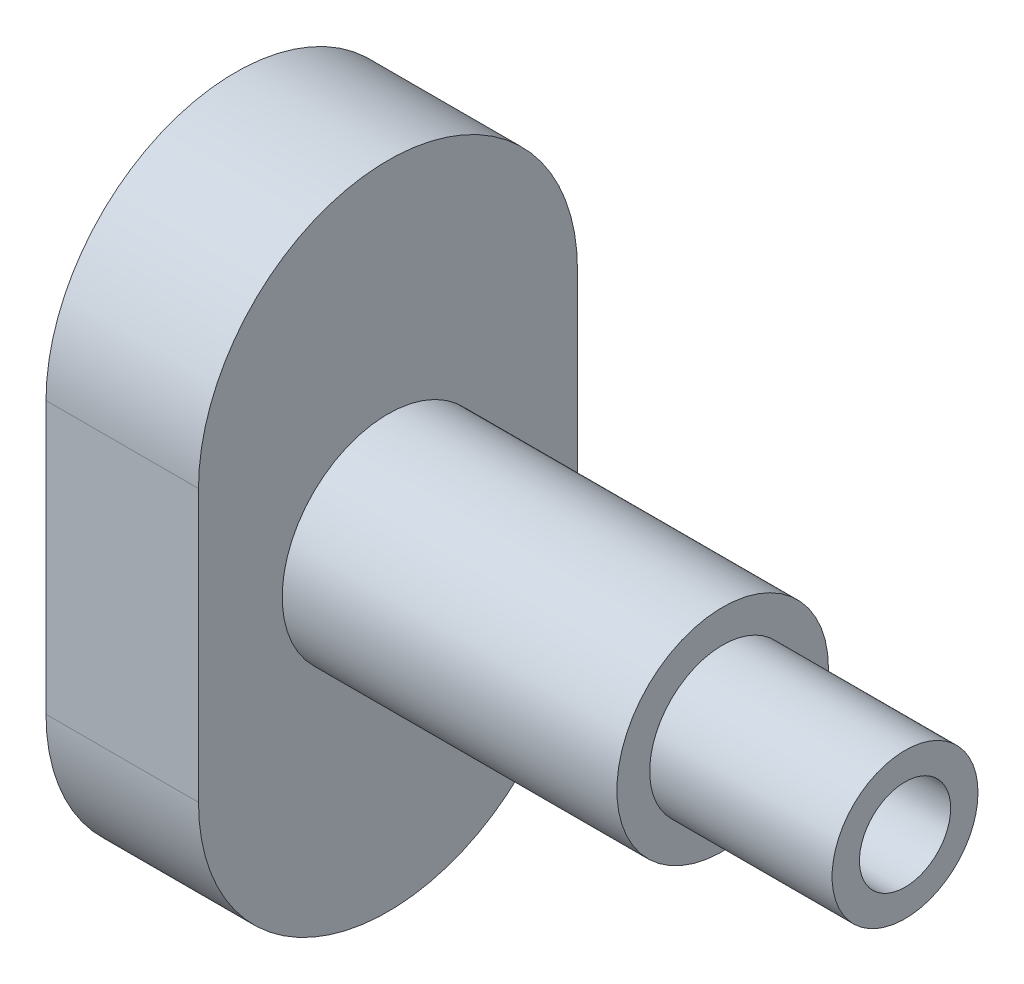
ISO-10303-21;
HEADER;
FILE_DESCRIPTION(('STEP AP214'),'2;1');
FILE_NAME('part.step','',(''),(''),'','','');
FILE_SCHEMA(('AUTOMOTIVE_DESIGN { 1 0 10303 214 1 1 1 1 }'));
ENDSEC;
DATA;
#1=APPLICATION_CONTEXT('core data for automotive mechanical design processes');
#2=APPLICATION_PROTOCOL_DEFINITION('international standard','automotive_design',2000,#1);
#3=PRODUCT_CONTEXT('',#1,'mechanical');
#4=PRODUCT('Part','Part','',(#3));
#5=PRODUCT_RELATED_PRODUCT_CATEGORY('part','',(#4));
#6=PRODUCT_DEFINITION_FORMATION('','',#4);
#7=PRODUCT_DEFINITION_CONTEXT('part definition',#1,'design');
#8=PRODUCT_DEFINITION('design','',#6,#7);
#9=PRODUCT_DEFINITION_SHAPE('','',#8);
#10=(LENGTH_UNIT() NAMED_UNIT(*) SI_UNIT(.MILLI.,.METRE.));
#11=(NAMED_UNIT(*) PLANE_ANGLE_UNIT() SI_UNIT($,.RADIAN.));
#12=(NAMED_UNIT(*) SI_UNIT($,.STERADIAN.) SOLID_ANGLE_UNIT());
#13=UNCERTAINTY_MEASURE_WITH_UNIT(LENGTH_MEASURE(1.E-05),#10,'distance_accuracy_value','');
#14=(GEOMETRIC_REPRESENTATION_CONTEXT(3) GLOBAL_UNCERTAINTY_ASSIGNED_CONTEXT((#13)) GLOBAL_UNIT_ASSIGNED_CONTEXT((#10,
#11,#12)) REPRESENTATION_CONTEXT('',''));
#15=CARTESIAN_POINT('',(0.,0.,0.));
#16=DIRECTION('',(0.,0.,1.));
#17=DIRECTION('',(1.,0.,0.));
#18=AXIS2_PLACEMENT_3D('',#15,#16,#17);
#19=CARTESIAN_POINT('',(8.36,-7.45,0.));
#20=DIRECTION('',(-1.,0.,0.));
#21=DIRECTION('',(0.,0.,1.));
#22=AXIS2_PLACEMENT_3D('',#19,#20,#21);
#23=CYLINDRICAL_SURFACE('',#22,10.39);
#24=CARTESIAN_POINT('',(0.,-7.45,0.));
#25=DIRECTION('',(1.,0.,0.));
#26=DIRECTION('',(0.,0.,-1.));
#27=AXIS2_PLACEMENT_3D('',#24,#25,#26);
#28=CIRCLE('',#27,10.39);
#29=CARTESIAN_POINT('',(0.,-7.45,10.39));
#30=VERTEX_POINT('',#29);
#31=CARTESIAN_POINT('',(0.,-7.45,-10.39));
#32=VERTEX_POINT('',#31);
#33=EDGE_CURVE('E106',#30,#32,#28,.T.);
#34=ORIENTED_EDGE('',*,*,#33,.T.);
#35=DIRECTION('',(-1.,0.,0.));
#36=VECTOR('',#35,1.);
#37=CARTESIAN_POINT('',(8.36,-7.45,-10.39));
#38=LINE('',#37,#36);
#39=CARTESIAN_POINT('',(8.36,-7.45,-10.39));
#40=VERTEX_POINT('',#39);
#41=EDGE_CURVE('E42',#40,#32,#38,.T.);
#42=ORIENTED_EDGE('',*,*,#41,.F.);
#43=CARTESIAN_POINT('',(8.36,-7.45,0.));
#44=DIRECTION('',(1.,0.,0.));
#45=DIRECTION('',(0.,0.,-1.));
#46=AXIS2_PLACEMENT_3D('',#43,#44,#45);
#47=CIRCLE('',#46,10.39);
#48=CARTESIAN_POINT('',(8.36,-7.45,10.39));
#49=VERTEX_POINT('',#48);
#50=EDGE_CURVE('E93',#49,#40,#47,.T.);
#51=ORIENTED_EDGE('',*,*,#50,.F.);
#52=DIRECTION('',(-1.,0.,0.));
#53=VECTOR('',#52,1.);
#54=CARTESIAN_POINT('',(8.36,-7.45,10.39));
#55=LINE('',#54,#53);
#56=EDGE_CURVE('E102',#49,#30,#55,.T.);
#57=ORIENTED_EDGE('',*,*,#56,.T.);
#58=EDGE_LOOP('',(#34,#42,#51,#57));
#59=FACE_BOUND('',#58,.T.);
#60=ADVANCED_FACE('F39',(#59),#23,.T.);
#61=CARTESIAN_POINT('',(8.36,-7.45,-10.39));
#62=DIRECTION('',(0.,0.,1.));
#63=DIRECTION('',(0.,-1.,0.));
#64=AXIS2_PLACEMENT_3D('',#61,#62,#63);
#65=PLANE('',#64);
#66=DIRECTION('',(0.,1.,0.));
#67=VECTOR('',#66,1.);
#68=CARTESIAN_POINT('',(0.,-7.45,-10.39));
#69=LINE('',#68,#67);
#70=CARTESIAN_POINT('',(0.,7.45,-10.39));
#71=VERTEX_POINT('',#70);
#72=EDGE_CURVE('E98',#32,#71,#69,.T.);
#73=ORIENTED_EDGE('',*,*,#72,.T.);
#74=DIRECTION('',(-1.,0.,0.));
#75=VECTOR('',#74,1.);
#76=CARTESIAN_POINT('',(8.36,7.45,-10.39));
#77=LINE('',#76,#75);
#78=CARTESIAN_POINT('',(8.36,7.45,-10.39));
#79=VERTEX_POINT('',#78);
#80=EDGE_CURVE('E96',#79,#71,#77,.T.);
#81=ORIENTED_EDGE('',*,*,#80,.F.);
#82=DIRECTION('',(0.,1.,0.));
#83=VECTOR('',#82,1.);
#84=CARTESIAN_POINT('',(8.36,-7.45,-10.39));
#85=LINE('',#84,#83);
#86=EDGE_CURVE('E88',#40,#79,#85,.T.);
#87=ORIENTED_EDGE('',*,*,#86,.F.);
#88=ORIENTED_EDGE('',*,*,#41,.T.);
#89=EDGE_LOOP('',(#73,#81,#87,#88));
#90=FACE_BOUND('',#89,.T.);
#91=ADVANCED_FACE('F97',(#90),#65,.F.);
#92=CARTESIAN_POINT('',(8.36,7.45,0.));
#93=DIRECTION('',(-1.,0.,0.));
#94=DIRECTION('',(0.,0.,1.));
#95=AXIS2_PLACEMENT_3D('',#92,#93,#94);
#96=CYLINDRICAL_SURFACE('',#95,10.39);
#97=CARTESIAN_POINT('',(0.,7.45,0.));
#98=DIRECTION('',(1.,0.,0.));
#99=DIRECTION('',(0.,0.,-1.));
#100=AXIS2_PLACEMENT_3D('',#97,#98,#99);
#101=CIRCLE('',#100,10.39);
#102=CARTESIAN_POINT('',(0.,7.45,10.39));
#103=VERTEX_POINT('',#102);
#104=EDGE_CURVE('E74',#71,#103,#101,.T.);
#105=ORIENTED_EDGE('',*,*,#104,.T.);
#106=DIRECTION('',(-1.,0.,0.));
#107=VECTOR('',#106,1.);
#108=CARTESIAN_POINT('',(8.36,7.45,10.39));
#109=LINE('',#108,#107);
#110=CARTESIAN_POINT('',(8.36,7.45,10.39));
#111=VERTEX_POINT('',#110);
#112=EDGE_CURVE('E99',#111,#103,#109,.T.);
#113=ORIENTED_EDGE('',*,*,#112,.F.);
#114=CARTESIAN_POINT('',(8.36,7.45,0.));
#115=DIRECTION('',(1.,0.,0.));
#116=DIRECTION('',(0.,0.,-1.));
#117=AXIS2_PLACEMENT_3D('',#114,#115,#116);
#118=CIRCLE('',#117,10.39);
#119=EDGE_CURVE('E91',#79,#111,#118,.T.);
#120=ORIENTED_EDGE('',*,*,#119,.F.);
#121=ORIENTED_EDGE('',*,*,#80,.T.);
#122=EDGE_LOOP('',(#105,#113,#120,#121));
#123=FACE_BOUND('',#122,.T.);
#124=ADVANCED_FACE('F100',(#123),#96,.T.);
#125=CARTESIAN_POINT('',(8.36,-7.45,10.39));
#126=DIRECTION('',(0.,0.,-1.));
#127=DIRECTION('',(0.,1.,0.));
#128=AXIS2_PLACEMENT_3D('',#125,#126,#127);
#129=PLANE('',#128);
#130=DIRECTION('',(0.,-1.,0.));
#131=VECTOR('',#130,1.);
#132=CARTESIAN_POINT('',(0.,-7.45,10.39));
#133=LINE('',#132,#131);
#134=EDGE_CURVE('E80',#103,#30,#133,.T.);
#135=ORIENTED_EDGE('',*,*,#134,.T.);
#136=ORIENTED_EDGE('',*,*,#56,.F.);
#137=DIRECTION('',(0.,-1.,0.));
#138=VECTOR('',#137,1.);
#139=CARTESIAN_POINT('',(8.36,-7.45,10.39));
#140=LINE('',#139,#138);
#141=EDGE_CURVE('E57',#111,#49,#140,.T.);
#142=ORIENTED_EDGE('',*,*,#141,.F.);
#143=ORIENTED_EDGE('',*,*,#112,.T.);
#144=EDGE_LOOP('',(#135,#136,#142,#143));
#145=FACE_BOUND('',#144,.T.);
#146=ADVANCED_FACE('F114',(#145),#129,.F.);
#147=CARTESIAN_POINT('',(8.36,-7.45,0.));
#148=DIRECTION('',(1.,0.,0.));
#149=DIRECTION('',(0.,0.,-1.));
#150=AXIS2_PLACEMENT_3D('',#147,#148,#149);
#151=PLANE('',#150);
#152=CARTESIAN_POINT('',(8.36,0.,0.));
#153=DIRECTION('',(1.,0.,0.));
#154=DIRECTION('',(0.,0.,-1.));
#155=AXIS2_PLACEMENT_3D('',#152,#153,#154);
#156=CIRCLE('',#155,5.8);
#157=CARTESIAN_POINT('',(8.36,0.,-5.8));
#158=VERTEX_POINT('',#157);
#159=EDGE_CURVE('E48',#158,#158,#156,.T.);
#160=ORIENTED_EDGE('',*,*,#159,.F.);
#161=EDGE_LOOP('',(#160));
#162=FACE_BOUND('',#161,.T.);
#163=ORIENTED_EDGE('',*,*,#50,.T.);
#164=ORIENTED_EDGE('',*,*,#86,.T.);
#165=ORIENTED_EDGE('',*,*,#119,.T.);
#166=ORIENTED_EDGE('',*,*,#141,.T.);
#167=EDGE_LOOP('',(#163,#164,#165,#166));
#168=FACE_BOUND('',#167,.T.);
#169=ADVANCED_FACE('F89',(#162,#168),#151,.T.);
#170=CARTESIAN_POINT('',(0.,-7.45,0.));
#171=DIRECTION('',(1.,0.,0.));
#172=DIRECTION('',(0.,0.,-1.));
#173=AXIS2_PLACEMENT_3D('',#170,#171,#172);
#174=PLANE('',#173);
#175=CARTESIAN_POINT('',(0.,0.,0.));
#176=DIRECTION('',(1.,0.,0.));
#177=DIRECTION('',(0.,0.,-1.));
#178=AXIS2_PLACEMENT_3D('',#175,#176,#177);
#179=CIRCLE('',#178,2.5);
#180=CARTESIAN_POINT('',(0.,0.,-2.5));
#181=VERTEX_POINT('',#180);
#182=EDGE_CURVE('E127',#181,#181,#179,.T.);
#183=ORIENTED_EDGE('',*,*,#182,.T.);
#184=EDGE_LOOP('',(#183));
#185=FACE_BOUND('',#184,.T.);
#186=ORIENTED_EDGE('',*,*,#33,.F.);
#187=ORIENTED_EDGE('',*,*,#134,.F.);
#188=ORIENTED_EDGE('',*,*,#104,.F.);
#189=ORIENTED_EDGE('',*,*,#72,.F.);
#190=EDGE_LOOP('',(#186,#187,#188,#189));
#191=FACE_BOUND('',#190,.T.);
#192=ADVANCED_FACE('F117',(#185,#191),#174,.F.);
#193=CARTESIAN_POINT('',(26.71,0.,0.));
#194=DIRECTION('',(-1.,0.,0.));
#195=DIRECTION('',(0.,0.,1.));
#196=AXIS2_PLACEMENT_3D('',#193,#194,#195);
#197=CYLINDRICAL_SURFACE('',#196,5.8);
#198=CARTESIAN_POINT('',(26.71,0.,0.));
#199=DIRECTION('',(1.,0.,0.));
#200=DIRECTION('',(0.,0.,-1.));
#201=AXIS2_PLACEMENT_3D('',#198,#199,#200);
#202=CIRCLE('',#201,5.8);
#203=CARTESIAN_POINT('',(26.71,0.,-5.8));
#204=VERTEX_POINT('',#203);
#205=EDGE_CURVE('E109',#204,#204,#202,.T.);
#206=ORIENTED_EDGE('',*,*,#205,.F.);
#207=EDGE_LOOP('',(#206));
#208=FACE_BOUND('',#207,.T.);
#209=ORIENTED_EDGE('',*,*,#159,.T.);
#210=EDGE_LOOP('',(#209));
#211=FACE_BOUND('',#210,.T.);
#212=ADVANCED_FACE('F156',(#208,#211),#197,.T.);
#213=CARTESIAN_POINT('',(26.71,0.,0.));
#214=DIRECTION('',(1.,0.,0.));
#215=DIRECTION('',(0.,0.,-1.));
#216=AXIS2_PLACEMENT_3D('',#213,#214,#215);
#217=PLANE('',#216);
#218=CARTESIAN_POINT('',(26.71,0.,0.));
#219=DIRECTION('',(1.,0.,0.));
#220=DIRECTION('',(0.,0.,-1.));
#221=AXIS2_PLACEMENT_3D('',#218,#219,#220);
#222=CIRCLE('',#221,4.);
#223=CARTESIAN_POINT('',(26.71,0.,-4.));
#224=VERTEX_POINT('',#223);
#225=EDGE_CURVE('E11',#224,#224,#222,.T.);
#226=ORIENTED_EDGE('',*,*,#225,.F.);
#227=EDGE_LOOP('',(#226));
#228=FACE_BOUND('',#227,.T.);
#229=ORIENTED_EDGE('',*,*,#205,.T.);
#230=EDGE_LOOP('',(#229));
#231=FACE_BOUND('',#230,.T.);
#232=ADVANCED_FACE('F150',(#228,#231),#217,.T.);
#233=CARTESIAN_POINT('',(36.71,0.,0.));
#234=DIRECTION('',(-1.,0.,0.));
#235=DIRECTION('',(0.,0.,1.));
#236=AXIS2_PLACEMENT_3D('',#233,#234,#235);
#237=CYLINDRICAL_SURFACE('',#236,4.);
#238=CARTESIAN_POINT('',(36.71,0.,0.));
#239=DIRECTION('',(1.,0.,0.));
#240=DIRECTION('',(0.,0.,-1.));
#241=AXIS2_PLACEMENT_3D('',#238,#239,#240);
#242=CIRCLE('',#241,4.);
#243=CARTESIAN_POINT('',(36.71,0.,-4.));
#244=VERTEX_POINT('',#243);
#245=EDGE_CURVE('E123',#244,#244,#242,.T.);
#246=ORIENTED_EDGE('',*,*,#245,.F.);
#247=EDGE_LOOP('',(#246));
#248=FACE_BOUND('',#247,.T.);
#249=ORIENTED_EDGE('',*,*,#225,.T.);
#250=EDGE_LOOP('',(#249));
#251=FACE_BOUND('',#250,.T.);
#252=ADVANCED_FACE('F144',(#248,#251),#237,.T.);
#253=CARTESIAN_POINT('',(36.71,0.,0.));
#254=DIRECTION('',(1.,0.,0.));
#255=DIRECTION('',(0.,0.,-1.));
#256=AXIS2_PLACEMENT_3D('',#253,#254,#255);
#257=PLANE('',#256);
#258=CARTESIAN_POINT('',(36.71,0.,0.));
#259=DIRECTION('',(1.,0.,0.));
#260=DIRECTION('',(0.,0.,-1.));
#261=AXIS2_PLACEMENT_3D('',#258,#259,#260);
#262=CIRCLE('',#261,2.5);
#263=CARTESIAN_POINT('',(36.71,0.,-2.5));
#264=VERTEX_POINT('',#263);
#265=EDGE_CURVE('E128',#264,#264,#262,.T.);
#266=ORIENTED_EDGE('',*,*,#265,.F.);
#267=EDGE_LOOP('',(#266));
#268=FACE_BOUND('',#267,.T.);
#269=ORIENTED_EDGE('',*,*,#245,.T.);
#270=EDGE_LOOP('',(#269));
#271=FACE_BOUND('',#270,.T.);
#272=ADVANCED_FACE('F138',(#268,#271),#257,.T.);
#273=CARTESIAN_POINT('',(0.,0.,0.));
#274=DIRECTION('',(1.,0.,0.));
#275=DIRECTION('',(0.,0.,-1.));
#276=AXIS2_PLACEMENT_3D('',#273,#274,#275);
#277=CYLINDRICAL_SURFACE('',#276,2.5);
#278=ORIENTED_EDGE('',*,*,#182,.F.);
#279=EDGE_LOOP('',(#278));
#280=FACE_BOUND('',#279,.T.);
#281=ORIENTED_EDGE('',*,*,#265,.T.);
#282=EDGE_LOOP('',(#281));
#283=FACE_BOUND('',#282,.T.);
#284=ADVANCED_FACE('F135',(#280,#283),#277,.F.);
#285=CLOSED_SHELL('',(#60,#91,#124,#146,#169,#192,#212,#232,#252,#272,#284));
#286=MANIFOLD_SOLID_BREP('B2',#285);
#287=ADVANCED_BREP_SHAPE_REPRESENTATION('',(#18,#286),#14);
#288=SHAPE_DEFINITION_REPRESENTATION(#9,#287);
ENDSEC;
END-ISO-10303-21;
